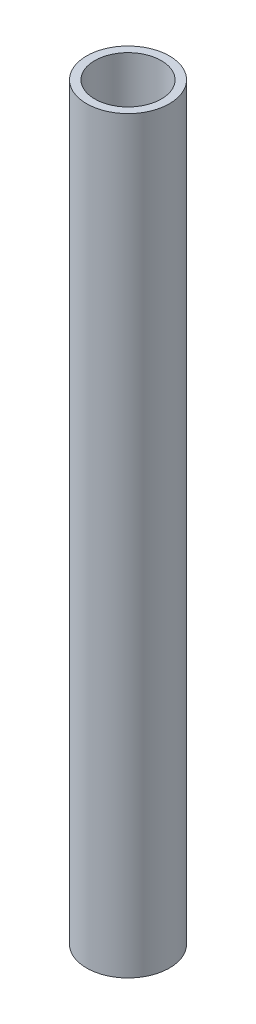
ISO-10303-21;
HEADER;
FILE_DESCRIPTION(('STEP AP214'),'2;1');
FILE_NAME('part.step','',(''),(''),'','','');
FILE_SCHEMA(('AUTOMOTIVE_DESIGN { 1 0 10303 214 1 1 1 1 }'));
ENDSEC;
DATA;
#1=APPLICATION_CONTEXT('core data for automotive mechanical design processes');
#2=APPLICATION_PROTOCOL_DEFINITION('international standard','automotive_design',2000,#1);
#3=PRODUCT_CONTEXT('',#1,'mechanical');
#4=PRODUCT('Part','Part','',(#3));
#5=PRODUCT_RELATED_PRODUCT_CATEGORY('part','',(#4));
#6=PRODUCT_DEFINITION_FORMATION('','',#4);
#7=PRODUCT_DEFINITION_CONTEXT('part definition',#1,'design');
#8=PRODUCT_DEFINITION('design','',#6,#7);
#9=PRODUCT_DEFINITION_SHAPE('','',#8);
#10=(LENGTH_UNIT() NAMED_UNIT(*) SI_UNIT(.MILLI.,.METRE.));
#11=(NAMED_UNIT(*) PLANE_ANGLE_UNIT() SI_UNIT($,.RADIAN.));
#12=(NAMED_UNIT(*) SI_UNIT($,.STERADIAN.) SOLID_ANGLE_UNIT());
#13=UNCERTAINTY_MEASURE_WITH_UNIT(LENGTH_MEASURE(1.E-05),#10,'distance_accuracy_value','');
#14=(GEOMETRIC_REPRESENTATION_CONTEXT(3) GLOBAL_UNCERTAINTY_ASSIGNED_CONTEXT((#13)) GLOBAL_UNIT_ASSIGNED_CONTEXT((#10,
#11,#12)) REPRESENTATION_CONTEXT('',''));
#15=CARTESIAN_POINT('',(0.,0.,0.));
#16=DIRECTION('',(0.,0.,1.));
#17=DIRECTION('',(1.,0.,0.));
#18=AXIS2_PLACEMENT_3D('',#15,#16,#17);
#19=CARTESIAN_POINT('',(0.,233.68,0.));
#20=DIRECTION('',(0.,1.,0.));
#21=DIRECTION('',(0.,0.,1.));
#22=AXIS2_PLACEMENT_3D('',#19,#20,#21);
#23=PLANE('',#22);
#24=CARTESIAN_POINT('',(0.,233.68,0.));
#25=DIRECTION('',(0.,1.,0.));
#26=DIRECTION('',(0.,0.,1.));
#27=AXIS2_PLACEMENT_3D('',#24,#25,#26);
#28=CIRCLE('',#27,12.935);
#29=CARTESIAN_POINT('',(0.,233.68,-12.935));
#30=VERTEX_POINT('',#29);
#31=EDGE_CURVE('E10',#30,#30,#28,.T.);
#32=ORIENTED_EDGE('',*,*,#31,.T.);
#33=EDGE_LOOP('',(#32));
#34=FACE_BOUND('',#33,.T.);
#35=CARTESIAN_POINT('',(0.,233.68,0.));
#36=DIRECTION('',(0.,1.,0.));
#37=DIRECTION('',(0.,0.,1.));
#38=AXIS2_PLACEMENT_3D('',#35,#36,#37);
#39=CIRCLE('',#38,10.395);
#40=CARTESIAN_POINT('',(0.,233.68,-10.395));
#41=VERTEX_POINT('',#40);
#42=EDGE_CURVE('E42',#41,#41,#39,.T.);
#43=ORIENTED_EDGE('',*,*,#42,.F.);
#44=EDGE_LOOP('',(#43));
#45=FACE_BOUND('',#44,.T.);
#46=ADVANCED_FACE('F31',(#34,#45),#23,.T.);
#47=CARTESIAN_POINT('',(0.,0.,0.));
#48=DIRECTION('',(0.,1.,0.));
#49=DIRECTION('',(0.,0.,1.));
#50=AXIS2_PLACEMENT_3D('',#47,#48,#49);
#51=PLANE('',#50);
#52=CARTESIAN_POINT('',(0.,0.,0.));
#53=DIRECTION('',(0.,1.,0.));
#54=DIRECTION('',(0.,0.,1.));
#55=AXIS2_PLACEMENT_3D('',#52,#53,#54);
#56=CIRCLE('',#55,12.935);
#57=CARTESIAN_POINT('',(0.,0.,-12.935));
#58=VERTEX_POINT('',#57);
#59=EDGE_CURVE('E35',#58,#58,#56,.T.);
#60=ORIENTED_EDGE('',*,*,#59,.F.);
#61=EDGE_LOOP('',(#60));
#62=FACE_BOUND('',#61,.T.);
#63=CARTESIAN_POINT('',(0.,0.,0.));
#64=DIRECTION('',(0.,1.,0.));
#65=DIRECTION('',(0.,0.,1.));
#66=AXIS2_PLACEMENT_3D('',#63,#64,#65);
#67=CIRCLE('',#66,10.395);
#68=CARTESIAN_POINT('',(0.,0.,-10.395));
#69=VERTEX_POINT('',#68);
#70=EDGE_CURVE('E44',#69,#69,#67,.T.);
#71=ORIENTED_EDGE('',*,*,#70,.T.);
#72=EDGE_LOOP('',(#71));
#73=FACE_BOUND('',#72,.T.);
#74=ADVANCED_FACE('F54',(#62,#73),#51,.F.);
#75=CARTESIAN_POINT('',(0.,233.68,0.));
#76=DIRECTION('',(0.,-1.,0.));
#77=DIRECTION('',(0.,0.,-1.));
#78=AXIS2_PLACEMENT_3D('',#75,#76,#77);
#79=CYLINDRICAL_SURFACE('',#78,12.935);
#80=CARTESIAN_POINT('',(0.,233.68,-12.935));
#81=CARTESIAN_POINT('',(0.,231.245833333333,-12.935));
#82=CARTESIAN_POINT('',(0.,228.811666666667,-12.935));
#83=CARTESIAN_POINT('',(0.,223.943333333333,-12.935));
#84=CARTESIAN_POINT('',(0.,221.509166666667,-12.935));
#85=CARTESIAN_POINT('',(0.,216.640833333333,-12.935));
#86=CARTESIAN_POINT('',(0.,214.206666666667,-12.935));
#87=CARTESIAN_POINT('',(0.,209.338333333333,-12.935));
#88=CARTESIAN_POINT('',(0.,206.904166666667,-12.935));
#89=CARTESIAN_POINT('',(0.,202.035833333333,-12.935));
#90=CARTESIAN_POINT('',(0.,199.601666666667,-12.935));
#91=CARTESIAN_POINT('',(0.,194.733333333333,-12.935));
#92=CARTESIAN_POINT('',(0.,192.299166666667,-12.935));
#93=CARTESIAN_POINT('',(0.,187.430833333333,-12.935));
#94=CARTESIAN_POINT('',(0.,184.996666666667,-12.935));
#95=CARTESIAN_POINT('',(0.,180.128333333333,-12.935));
#96=CARTESIAN_POINT('',(0.,177.694166666667,-12.935));
#97=CARTESIAN_POINT('',(0.,172.825833333333,-12.935));
#98=CARTESIAN_POINT('',(0.,170.391666666667,-12.935));
#99=CARTESIAN_POINT('',(0.,165.523333333333,-12.935));
#100=CARTESIAN_POINT('',(0.,163.089166666667,-12.935));
#101=CARTESIAN_POINT('',(0.,158.220833333333,-12.935));
#102=CARTESIAN_POINT('',(0.,155.786666666667,-12.935));
#103=CARTESIAN_POINT('',(0.,150.918333333333,-12.935));
#104=CARTESIAN_POINT('',(0.,148.484166666667,-12.935));
#105=CARTESIAN_POINT('',(0.,143.615833333333,-12.935));
#106=CARTESIAN_POINT('',(0.,141.181666666667,-12.935));
#107=CARTESIAN_POINT('',(0.,136.313333333333,-12.935));
#108=CARTESIAN_POINT('',(0.,133.879166666667,-12.935));
#109=CARTESIAN_POINT('',(0.,129.010833333333,-12.935));
#110=CARTESIAN_POINT('',(0.,126.576666666667,-12.935));
#111=CARTESIAN_POINT('',(0.,121.708333333333,-12.935));
#112=CARTESIAN_POINT('',(0.,119.274166666667,-12.935));
#113=CARTESIAN_POINT('',(0.,114.405833333333,-12.935));
#114=CARTESIAN_POINT('',(0.,111.971666666667,-12.935));
#115=CARTESIAN_POINT('',(0.,107.103333333333,-12.935));
#116=CARTESIAN_POINT('',(0.,104.669166666667,-12.935));
#117=CARTESIAN_POINT('',(0.,99.8008333333333,-12.935));
#118=CARTESIAN_POINT('',(0.,97.3666666666667,-12.935));
#119=CARTESIAN_POINT('',(0.,92.4983333333333,-12.935));
#120=CARTESIAN_POINT('',(0.,90.0641666666667,-12.935));
#121=CARTESIAN_POINT('',(0.,85.1958333333333,-12.935));
#122=CARTESIAN_POINT('',(0.,82.7616666666667,-12.935));
#123=CARTESIAN_POINT('',(0.,77.8933333333333,-12.935));
#124=CARTESIAN_POINT('',(0.,75.4591666666667,-12.935));
#125=CARTESIAN_POINT('',(0.,70.5908333333333,-12.935));
#126=CARTESIAN_POINT('',(0.,68.1566666666667,-12.935));
#127=CARTESIAN_POINT('',(0.,63.2883333333333,-12.935));
#128=CARTESIAN_POINT('',(0.,60.8541666666667,-12.935));
#129=CARTESIAN_POINT('',(0.,55.9858333333333,-12.935));
#130=CARTESIAN_POINT('',(0.,53.5516666666667,-12.935));
#131=CARTESIAN_POINT('',(0.,48.6833333333333,-12.935));
#132=CARTESIAN_POINT('',(0.,46.2491666666667,-12.935));
#133=CARTESIAN_POINT('',(0.,41.3808333333333,-12.935));
#134=CARTESIAN_POINT('',(0.,38.9466666666667,-12.935));
#135=CARTESIAN_POINT('',(0.,34.0783333333333,-12.935));
#136=CARTESIAN_POINT('',(0.,31.6441666666667,-12.935));
#137=CARTESIAN_POINT('',(0.,26.7758333333333,-12.935));
#138=CARTESIAN_POINT('',(0.,24.3416666666667,-12.935));
#139=CARTESIAN_POINT('',(0.,19.4733333333333,-12.935));
#140=CARTESIAN_POINT('',(0.,17.0391666666667,-12.935));
#141=CARTESIAN_POINT('',(0.,12.1708333333333,-12.935));
#142=CARTESIAN_POINT('',(0.,9.73666666666666,-12.935));
#143=CARTESIAN_POINT('',(0.,4.86833333333333,-12.935));
#144=CARTESIAN_POINT('',(0.,2.43416666666666,-12.935));
#145=CARTESIAN_POINT('',(0.,0.,-12.935));
#146=B_SPLINE_CURVE_WITH_KNOTS('',3,(#80,#81,#82,#83,#84,#85,#86,#87,#88,#89,#90,#91,#92,#93,
#94,#95,#96,#97,#98,#99,#100,#101,#102,#103,#104,#105,#106,#107,#108,#109,#110,#111,#112,#113,
#114,#115,#116,#117,#118,#119,#120,#121,#122,#123,#124,#125,#126,#127,#128,#129,#130,#131,#132,
#133,#134,#135,#136,#137,#138,#139,#140,#141,#142,#143,#144,#145),.UNSPECIFIED.,.F.,.F.,(4,2,2,
2,2,2,2,2,2,2,2,2,2,2,2,2,2,2,2,2,2,2,2,2,2,2,2,2,2,2,2,2,4),(0.,7.30250000000002,14.605,
21.9075,29.21,36.5125,43.815,51.1175,58.42,65.7225,73.025,80.3275,87.63,94.9325,102.235,
109.5375,116.84,124.1425,131.445,138.7475,146.05,153.3525,160.655,167.9575,175.26,182.5625,
189.865,197.1675,204.47,211.7725,219.075,226.3775,233.68),.UNSPECIFIED.);
#147=EDGE_CURVE('BSEAM33',#30,#58,#146,.T.);
#148=ORIENTED_EDGE('',*,*,#31,.F.);
#149=ORIENTED_EDGE('',*,*,#59,.T.);
#150=ORIENTED_EDGE('',*,*,#147,.T.);
#151=ORIENTED_EDGE('',*,*,#147,.F.);
#152=EDGE_LOOP('',(#148,#150,#149,#151));
#153=FACE_BOUND('',#152,.T.);
#154=ADVANCED_FACE('F33',(#153),#79,.T.);
#155=CARTESIAN_POINT('',(0.,233.68,0.));
#156=DIRECTION('',(0.,-1.,0.));
#157=DIRECTION('',(0.,0.,-1.));
#158=AXIS2_PLACEMENT_3D('',#155,#156,#157);
#159=CYLINDRICAL_SURFACE('',#158,10.395);
#160=CARTESIAN_POINT('',(0.,233.68,-10.395));
#161=CARTESIAN_POINT('',(0.,231.245833333333,-10.395));
#162=CARTESIAN_POINT('',(0.,228.811666666667,-10.395));
#163=CARTESIAN_POINT('',(0.,223.943333333333,-10.395));
#164=CARTESIAN_POINT('',(0.,221.509166666667,-10.395));
#165=CARTESIAN_POINT('',(0.,216.640833333333,-10.395));
#166=CARTESIAN_POINT('',(0.,214.206666666667,-10.395));
#167=CARTESIAN_POINT('',(0.,209.338333333333,-10.395));
#168=CARTESIAN_POINT('',(0.,206.904166666667,-10.395));
#169=CARTESIAN_POINT('',(0.,202.035833333333,-10.395));
#170=CARTESIAN_POINT('',(0.,199.601666666667,-10.395));
#171=CARTESIAN_POINT('',(0.,194.733333333333,-10.395));
#172=CARTESIAN_POINT('',(0.,192.299166666667,-10.395));
#173=CARTESIAN_POINT('',(0.,187.430833333333,-10.395));
#174=CARTESIAN_POINT('',(0.,184.996666666667,-10.395));
#175=CARTESIAN_POINT('',(0.,180.128333333333,-10.395));
#176=CARTESIAN_POINT('',(0.,177.694166666667,-10.395));
#177=CARTESIAN_POINT('',(0.,172.825833333333,-10.395));
#178=CARTESIAN_POINT('',(0.,170.391666666667,-10.395));
#179=CARTESIAN_POINT('',(0.,165.523333333333,-10.395));
#180=CARTESIAN_POINT('',(0.,163.089166666667,-10.395));
#181=CARTESIAN_POINT('',(0.,158.220833333333,-10.395));
#182=CARTESIAN_POINT('',(0.,155.786666666667,-10.395));
#183=CARTESIAN_POINT('',(0.,150.918333333333,-10.395));
#184=CARTESIAN_POINT('',(0.,148.484166666667,-10.395));
#185=CARTESIAN_POINT('',(0.,143.615833333333,-10.395));
#186=CARTESIAN_POINT('',(0.,141.181666666667,-10.395));
#187=CARTESIAN_POINT('',(0.,136.313333333333,-10.395));
#188=CARTESIAN_POINT('',(0.,133.879166666667,-10.395));
#189=CARTESIAN_POINT('',(0.,129.010833333333,-10.395));
#190=CARTESIAN_POINT('',(0.,126.576666666667,-10.395));
#191=CARTESIAN_POINT('',(0.,121.708333333333,-10.395));
#192=CARTESIAN_POINT('',(0.,119.274166666667,-10.395));
#193=CARTESIAN_POINT('',(0.,114.405833333333,-10.395));
#194=CARTESIAN_POINT('',(0.,111.971666666667,-10.395));
#195=CARTESIAN_POINT('',(0.,107.103333333333,-10.395));
#196=CARTESIAN_POINT('',(0.,104.669166666667,-10.395));
#197=CARTESIAN_POINT('',(0.,99.8008333333333,-10.395));
#198=CARTESIAN_POINT('',(0.,97.3666666666666,-10.395));
#199=CARTESIAN_POINT('',(0.,92.4983333333333,-10.395));
#200=CARTESIAN_POINT('',(0.,90.0641666666667,-10.395));
#201=CARTESIAN_POINT('',(0.,85.1958333333333,-10.395));
#202=CARTESIAN_POINT('',(0.,82.7616666666667,-10.395));
#203=CARTESIAN_POINT('',(0.,77.8933333333333,-10.395));
#204=CARTESIAN_POINT('',(0.,75.4591666666666,-10.395));
#205=CARTESIAN_POINT('',(0.,70.5908333333333,-10.395));
#206=CARTESIAN_POINT('',(0.,68.1566666666667,-10.395));
#207=CARTESIAN_POINT('',(0.,63.2883333333333,-10.395));
#208=CARTESIAN_POINT('',(0.,60.8541666666667,-10.395));
#209=CARTESIAN_POINT('',(0.,55.9858333333333,-10.395));
#210=CARTESIAN_POINT('',(0.,53.5516666666667,-10.395));
#211=CARTESIAN_POINT('',(0.,48.6833333333333,-10.395));
#212=CARTESIAN_POINT('',(0.,46.2491666666667,-10.395));
#213=CARTESIAN_POINT('',(0.,41.3808333333333,-10.395));
#214=CARTESIAN_POINT('',(0.,38.9466666666667,-10.395));
#215=CARTESIAN_POINT('',(0.,34.0783333333333,-10.395));
#216=CARTESIAN_POINT('',(0.,31.6441666666667,-10.395));
#217=CARTESIAN_POINT('',(0.,26.7758333333333,-10.395));
#218=CARTESIAN_POINT('',(0.,24.3416666666667,-10.395));
#219=CARTESIAN_POINT('',(0.,19.4733333333333,-10.395));
#220=CARTESIAN_POINT('',(0.,17.0391666666667,-10.395));
#221=CARTESIAN_POINT('',(0.,12.1708333333333,-10.395));
#222=CARTESIAN_POINT('',(0.,9.73666666666666,-10.395));
#223=CARTESIAN_POINT('',(0.,4.86833333333333,-10.395));
#224=CARTESIAN_POINT('',(0.,2.43416666666666,-10.395));
#225=CARTESIAN_POINT('',(0.,0.,-10.395));
#226=B_SPLINE_CURVE_WITH_KNOTS('',3,(#160,#161,#162,#163,#164,#165,#166,#167,#168,#169,#170,
#171,#172,#173,#174,#175,#176,#177,#178,#179,#180,#181,#182,#183,#184,#185,#186,#187,#188,#189,
#190,#191,#192,#193,#194,#195,#196,#197,#198,#199,#200,#201,#202,#203,#204,#205,#206,#207,#208,
#209,#210,#211,#212,#213,#214,#215,#216,#217,#218,#219,#220,#221,#222,#223,#224,#225),
.UNSPECIFIED.,.F.,.F.,(4,2,2,2,2,2,2,2,2,2,2,2,2,2,2,2,2,2,2,2,2,2,2,2,2,2,2,2,2,2,2,2,4),(0.,
7.30249999999999,14.605,21.9075,29.21,36.5125,43.815,51.1175,58.42,65.7225,73.0249999999999,
80.3275,87.63,94.9325,102.235,109.5375,116.84,124.1425,131.445,138.7475,146.05,153.3525,160.655,
167.9575,175.26,182.5625,189.865,197.1675,204.47,211.7725,219.075,226.3775,233.68),.UNSPECIFIED.);
#227=EDGE_CURVE('BSEAM50',#41,#69,#226,.T.);
#228=ORIENTED_EDGE('',*,*,#42,.T.);
#229=ORIENTED_EDGE('',*,*,#70,.F.);
#230=ORIENTED_EDGE('',*,*,#227,.T.);
#231=ORIENTED_EDGE('',*,*,#227,.F.);
#232=EDGE_LOOP('',(#228,#230,#229,#231));
#233=FACE_BOUND('',#232,.T.);
#234=ADVANCED_FACE('F50',(#233),#159,.F.);
#235=CLOSED_SHELL('',(#46,#74,#154,#234));
#236=MANIFOLD_SOLID_BREP('B2',#235);
#237=ADVANCED_BREP_SHAPE_REPRESENTATION('',(#18,#236),#14);
#238=SHAPE_DEFINITION_REPRESENTATION(#9,#237);
ENDSEC;
END-ISO-10303-21;
